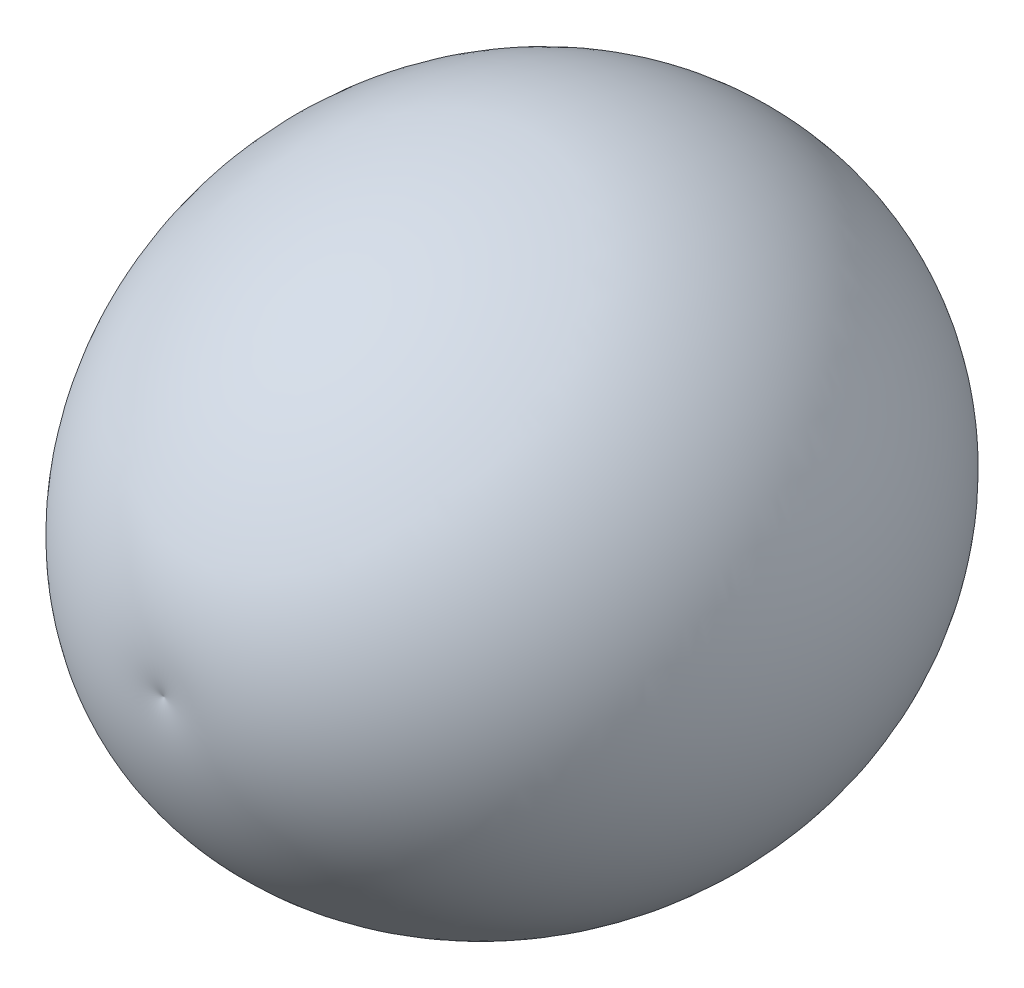
ISO-10303-21;
HEADER;
FILE_DESCRIPTION(('STEP AP214'),'2;1');
FILE_NAME('part.step','',(''),(''),'','','');
FILE_SCHEMA(('AUTOMOTIVE_DESIGN { 1 0 10303 214 1 1 1 1 }'));
ENDSEC;
DATA;
#1=APPLICATION_CONTEXT('core data for automotive mechanical design processes');
#2=APPLICATION_PROTOCOL_DEFINITION('international standard','automotive_design',2000,#1);
#3=PRODUCT_CONTEXT('',#1,'mechanical');
#4=PRODUCT('Part','Part','',(#3));
#5=PRODUCT_RELATED_PRODUCT_CATEGORY('part','',(#4));
#6=PRODUCT_DEFINITION_FORMATION('','',#4);
#7=PRODUCT_DEFINITION_CONTEXT('part definition',#1,'design');
#8=PRODUCT_DEFINITION('design','',#6,#7);
#9=PRODUCT_DEFINITION_SHAPE('','',#8);
#10=(LENGTH_UNIT() NAMED_UNIT(*) SI_UNIT(.MILLI.,.METRE.));
#11=(NAMED_UNIT(*) PLANE_ANGLE_UNIT() SI_UNIT($,.RADIAN.));
#12=(NAMED_UNIT(*) SI_UNIT($,.STERADIAN.) SOLID_ANGLE_UNIT());
#13=UNCERTAINTY_MEASURE_WITH_UNIT(LENGTH_MEASURE(1.E-05),#10,'distance_accuracy_value','');
#14=(GEOMETRIC_REPRESENTATION_CONTEXT(3) GLOBAL_UNCERTAINTY_ASSIGNED_CONTEXT((#13)) GLOBAL_UNIT_ASSIGNED_CONTEXT((#10,
#11,#12)) REPRESENTATION_CONTEXT('',''));
#15=CARTESIAN_POINT('',(0.,0.,0.));
#16=DIRECTION('',(0.,0.,1.));
#17=DIRECTION('',(1.,0.,0.));
#18=AXIS2_PLACEMENT_3D('',#15,#16,#17);
#19=CARTESIAN_POINT('',(2.18217710069348E-12,0.,3.88557729828071E-13));
#20=CARTESIAN_POINT('',(0.0617964023647328,0.,0.026084468833614));
#21=CARTESIAN_POINT('',(0.186171395576596,0.,0.0762625521818231));
#22=CARTESIAN_POINT('',(0.438119474181253,0.,0.168499763814301));
#23=CARTESIAN_POINT('',(0.820492001153097,0.,0.294039894972309));
#24=CARTESIAN_POINT('',(1.27066955731394,0.,0.427306606281663));
#25=CARTESIAN_POINT('',(1.91897097816755,0.,0.599190094761222));
#26=CARTESIAN_POINT('',(2.70310150271152,0.,0.780777898401379));
#27=CARTESIAN_POINT('',(3.62441208212896,0.,0.962503808624637));
#28=CARTESIAN_POINT('',(4.68357385300268,0.,1.13519643441063));
#29=CARTESIAN_POINT('',(6.01322010813073,0.,1.31237873441994));
#30=CARTESIAN_POINT('',(7.75032829028848,0.,1.48231120858648));
#31=CARTESIAN_POINT('',(9.89658985145154,0.,1.60120276121445));
#32=CARTESIAN_POINT('',(12.4498657433928,0.,1.62398658026441));
#33=CARTESIAN_POINT('',(15.1369496597981,0.,1.52969612808151));
#34=CARTESIAN_POINT('',(18.0288321311523,0.,1.3126529873515));
#35=CARTESIAN_POINT('',(21.1196708725406,0.,0.954329211181506));
#36=CARTESIAN_POINT('',(25.2750537376482,0.,0.299686803731422));
#37=CARTESIAN_POINT('',(30.4607438328898,0.,-0.810917114148153));
#38=CARTESIAN_POINT('',(36.4201711544264,0.,-2.47836137878469));
#39=CARTESIAN_POINT('',(44.7537489308454,0.,-5.42538740152853));
#40=CARTESIAN_POINT('',(54.210294113622,0.,-9.67394425021937));
#41=CARTESIAN_POINT('',(64.5738939753345,0.,-15.5079300826644));
#42=CARTESIAN_POINT('',(75.7699036372004,0.,-23.3303303746195));
#43=CARTESIAN_POINT('',(86.2103334549609,0.,-32.13430579475));
#44=CARTESIAN_POINT('',(98.5039518203583,0.,-44.5071740632759));
#45=CARTESIAN_POINT('',(111.658349980373,0.,-61.2075163833382));
#46=CARTESIAN_POINT('',(124.217702924829,0.,-82.6380961051165));
#47=CARTESIAN_POINT('',(134.511740749559,0.,-109.08874980509));
#48=CARTESIAN_POINT('',(140.539244653395,0.,-136.823984777638));
#49=CARTESIAN_POINT('',(142.124712042351,0.,-165.165585837077));
#50=CARTESIAN_POINT('',(139.508921392339,0.,-189.870900705309));
#51=CARTESIAN_POINT('',(134.364211850868,0.,-210.498439849097));
#52=CARTESIAN_POINT('',(128.771836165654,0.,-225.403505698291));
#53=CARTESIAN_POINT('',(124.328767006836,0.,-235.03610167598));
#54=CARTESIAN_POINT('',(120.156246067564,0.,-242.825005819961));
#55=CARTESIAN_POINT('',(116.539727952503,0.,-248.898775733551));
#56=CARTESIAN_POINT('',(111.676015438397,0.,-256.27602148303));
#57=CARTESIAN_POINT('',(106.363151586266,0.,-263.342091752905));
#58=CARTESIAN_POINT('',(100.615477372436,0.,-270.059819182962));
#59=CARTESIAN_POINT('',(94.4519959538805,0.,-276.392003819388));
#60=CARTESIAN_POINT('',(89.2803230591475,0.,-281.211675458327));
#61=CARTESIAN_POINT('',(83.8773840592994,0.,-285.770690998167));
#62=CARTESIAN_POINT('',(78.2538642418085,0.,-290.054769276043));
#63=CARTESIAN_POINT('',(72.6220516987163,0.,-293.912641916345));
#64=CARTESIAN_POINT('',(67.016645716158,0.,-297.364605166202));
#65=CARTESIAN_POINT('',(61.4691034724025,0.,-300.43322908842));
#66=CARTESIAN_POINT('',(56.0076441886344,0.,-303.142772213051));
#67=CARTESIAN_POINT('',(51.0156751631157,0.,-305.345016608043));
#68=CARTESIAN_POINT('',(46.5378940026801,0.,-307.115144280777));
#69=CARTESIAN_POINT('',(42.6077970418988,0.,-308.521431149217));
#70=CARTESIAN_POINT('',(39.2503955393751,0.,-309.623285068521));
#71=CARTESIAN_POINT('',(35.8646255351485,0.,-310.635404654443));
#72=CARTESIAN_POINT('',(32.4534517287676,0.,-311.55680384421));
#73=CARTESIAN_POINT('',(29.0181594992795,0.,-312.386577485599));
#74=CARTESIAN_POINT('',(25.5629724600645,0.,-313.123904135397));
#75=CARTESIAN_POINT('',(22.0873174173506,0.,-313.76804893255));
#76=CARTESIAN_POINT('',(18.5988137561713,0.,-314.318365892782));
#77=CARTESIAN_POINT('',(15.5292459825324,0.,-314.717308437183));
#78=CARTESIAN_POINT('',(12.8996785579044,0.,-314.999981496043));
#79=CARTESIAN_POINT('',(10.6912295027745,0.,-315.195909234741));
#80=CARTESIAN_POINT('',(8.94655489390514,0.,-315.328831667363));
#81=CARTESIAN_POINT('',(7.1996824771345,0.,-315.43491110831));
#82=CARTESIAN_POINT('',(5.58657572925124,0.,-315.516253721295));
#83=CARTESIAN_POINT('',(3.87399750217888,0.,-315.57490423822));
#84=CARTESIAN_POINT('',(2.46068837972743,0.,-315.612843310033));
#85=CARTESIAN_POINT('',(1.07354269719605,0.,-315.627071903227));
#86=CARTESIAN_POINT('',(0.357487537177518,0.,-315.630233812828));
#87=CARTESIAN_POINT('',(-1.3265214807952E-09,0.,-315.630233812824));
#88=B_SPLINE_CURVE_WITH_KNOTS('',4,(#19,#20,#21,#22,#23,#24,#25,#26,#27,#28,#29,#30,#31,#32,#33,
#34,#35,#36,#37,#38,#39,#40,#41,#42,#43,#44,#45,#46,#47,#48,#49,#50,#51,#52,#53,#54,#55,#56,#57,
#58,#59,#60,#61,#62,#63,#64,#65,#66,#67,#68,#69,#70,#71,#72,#73,#74,#75,#76,#77,#78,#79,#80,#81,
#82,#83,#84,#85,#86,#87),.UNSPECIFIED.,.F.,.F.,(5,1,1,1,1,1,1,1,1,1,1,1,1,1,1,1,1,1,1,1,1,1,1,1,
1,1,1,1,1,1,1,1,1,1,1,1,1,1,1,1,1,1,1,1,1,1,1,1,1,1,1,1,1,1,1,1,1,1,1,1,1,1,1,1,1,5),(0.,
0.000516629126413912,0.00103325825282782,0.00206651650565565,0.00309977475848347,
0.0041330330113113,0.00619954951696695,0.0082660660226226,0.0103325825282782,0.0123990990339339,
0.0165321320452452,0.0217090294384098,0.0268859268315743,0.0320628242247389,0.0372397216179034,
0.0440448451817518,0.0508499687456003,0.0644602158732971,0.0780700444307127,0.0916798729881284,
0.118899192257916,0.144215766640906,0.169532341023895,0.196751872216609,0.223971403409322,
0.278410539535434,0.332849765401117,0.387288816168775,0.441727967572643,0.496167108717227,
0.550606220608444,0.577825778900488,0.605045337192532,0.618655116625288,0.632264896058044,
0.6458746754908,0.659484454923556,0.686704005867329,0.700313781339215,0.713923556811101,
0.727533334790562,0.741143112770022,0.754752890749482,0.768362668728942,0.780100637774014,
0.791838606819085,0.803576575864156,0.815314544909227,0.822119434447002,0.828924323984777,
0.835729213522551,0.842534103060326,0.849338991210889,0.856143879361452,0.862948767512016,
0.869753655662579,0.876558544765072,0.883363433867566,0.886765878418812,0.890168322970059,
0.893570767521306,0.896973212072553,0.900002638615908,0.903032065159263,0.906061491702619,
0.909090918245974),.UNSPECIFIED.);
#89=CARTESIAN_POINT('',(0.,0.,-315.630233812824));
#90=DIRECTION('',(0.,0.,-1.));
#91=AXIS1_PLACEMENT('',#89,#90);
#92=SURFACE_OF_REVOLUTION('',#88,#91);
#93=CARTESIAN_POINT('',(0.,0.,-315.630233812824));
#94=VERTEX_POINT('',#93);
#95=VERTEX_LOOP('',#94);
#96=FACE_BOUND('',#95,.T.);
#97=CARTESIAN_POINT('',(3.91153377591637E-12,0.,1.11001973671782E-13));
#98=VERTEX_POINT('',#97);
#99=VERTEX_LOOP('',#98);
#100=FACE_BOUND('',#99,.T.);
#101=ADVANCED_FACE('F40',(#96,#100),#92,.T.);
#102=CLOSED_SHELL('',(#101));
#103=MANIFOLD_SOLID_BREP('B2',#102);
#104=ADVANCED_BREP_SHAPE_REPRESENTATION('',(#18,#103),#14);
#105=SHAPE_DEFINITION_REPRESENTATION(#9,#104);
ENDSEC;
END-ISO-10303-21;
